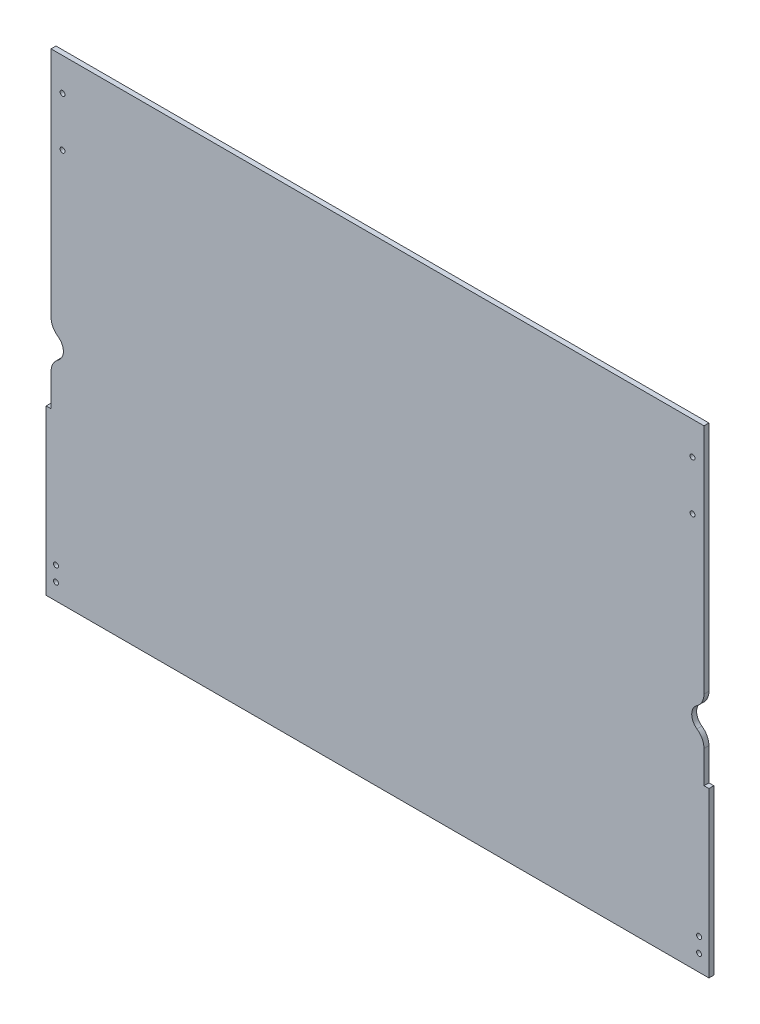
ISO-10303-21;
HEADER;
FILE_DESCRIPTION(('STEP AP214'),'2;1');
FILE_NAME('part.step','',(''),(''),'','','');
FILE_SCHEMA(('AUTOMOTIVE_DESIGN { 1 0 10303 214 1 1 1 1 }'));
ENDSEC;
DATA;
#1=APPLICATION_CONTEXT('core data for automotive mechanical design processes');
#2=APPLICATION_PROTOCOL_DEFINITION('international standard','automotive_design',2000,#1);
#3=PRODUCT_CONTEXT('',#1,'mechanical');
#4=PRODUCT('Part','Part','',(#3));
#5=PRODUCT_RELATED_PRODUCT_CATEGORY('part','',(#4));
#6=PRODUCT_DEFINITION_FORMATION('','',#4);
#7=PRODUCT_DEFINITION_CONTEXT('part definition',#1,'design');
#8=PRODUCT_DEFINITION('design','',#6,#7);
#9=PRODUCT_DEFINITION_SHAPE('','',#8);
#10=(LENGTH_UNIT() NAMED_UNIT(*) SI_UNIT(.MILLI.,.METRE.));
#11=(NAMED_UNIT(*) PLANE_ANGLE_UNIT() SI_UNIT($,.RADIAN.));
#12=(NAMED_UNIT(*) SI_UNIT($,.STERADIAN.) SOLID_ANGLE_UNIT());
#13=UNCERTAINTY_MEASURE_WITH_UNIT(LENGTH_MEASURE(1.E-05),#10,'distance_accuracy_value','');
#14=(GEOMETRIC_REPRESENTATION_CONTEXT(3) GLOBAL_UNCERTAINTY_ASSIGNED_CONTEXT((#13)) GLOBAL_UNIT_ASSIGNED_CONTEXT((#10,
#11,#12)) REPRESENTATION_CONTEXT('',''));
#15=CARTESIAN_POINT('',(0.,0.,0.));
#16=DIRECTION('',(0.,0.,1.));
#17=DIRECTION('',(1.,0.,0.));
#18=AXIS2_PLACEMENT_3D('',#15,#16,#17);
#19=CARTESIAN_POINT('',(199.,290.,3.));
#20=DIRECTION('',(-1.,0.,0.));
#21=DIRECTION('',(0.,-1.,0.));
#22=AXIS2_PLACEMENT_3D('',#19,#20,#21);
#23=PLANE('',#22);
#24=DIRECTION('',(0.,1.,0.));
#25=VECTOR('',#24,1.);
#26=CARTESIAN_POINT('',(199.,290.,0.));
#27=LINE('',#26,#25);
#28=CARTESIAN_POINT('',(199.,100.,0.));
#29=VERTEX_POINT('',#28);
#30=CARTESIAN_POINT('',(199.,119.638593383655,0.));
#31=VERTEX_POINT('',#30);
#32=EDGE_CURVE('E257',#29,#31,#27,.T.);
#33=ORIENTED_EDGE('',*,*,#32,.T.);
#34=DIRECTION('',(0.,0.,1.));
#35=VECTOR('',#34,1.);
#36=CARTESIAN_POINT('',(199.,119.638593383655,3.));
#37=LINE('',#36,#35);
#38=CARTESIAN_POINT('',(199.,119.638593383655,3.));
#39=VERTEX_POINT('',#38);
#40=EDGE_CURVE('E227',#31,#39,#37,.T.);
#41=ORIENTED_EDGE('',*,*,#40,.T.);
#42=DIRECTION('',(0.,1.,0.));
#43=VECTOR('',#42,1.);
#44=CARTESIAN_POINT('',(199.,290.,3.));
#45=LINE('',#44,#43);
#46=CARTESIAN_POINT('',(199.,100.,3.));
#47=VERTEX_POINT('',#46);
#48=EDGE_CURVE('E256',#47,#39,#45,.T.);
#49=ORIENTED_EDGE('',*,*,#48,.F.);
#50=DIRECTION('',(0.,0.,-1.));
#51=VECTOR('',#50,1.);
#52=CARTESIAN_POINT('',(199.,100.,3.));
#53=LINE('',#52,#51);
#54=EDGE_CURVE('E310',#47,#29,#53,.T.);
#55=ORIENTED_EDGE('',*,*,#54,.T.);
#56=EDGE_LOOP('',(#33,#41,#49,#55));
#57=FACE_BOUND('',#56,.T.);
#58=ADVANCED_FACE('F39',(#57),#23,.F.);
#59=CARTESIAN_POINT('',(-199.,290.,3.));
#60=DIRECTION('',(1.,0.,0.));
#61=DIRECTION('',(0.,1.,0.));
#62=AXIS2_PLACEMENT_3D('',#59,#60,#61);
#63=PLANE('',#62);
#64=DIRECTION('',(0.,-1.,0.));
#65=VECTOR('',#64,1.);
#66=CARTESIAN_POINT('',(-199.,290.,0.));
#67=LINE('',#66,#65);
#68=CARTESIAN_POINT('',(-199.,290.,0.));
#69=VERTEX_POINT('',#68);
#70=CARTESIAN_POINT('',(-199.,148.361406616345,0.));
#71=VERTEX_POINT('',#70);
#72=EDGE_CURVE('E180',#69,#71,#67,.T.);
#73=ORIENTED_EDGE('',*,*,#72,.T.);
#74=DIRECTION('',(0.,0.,1.));
#75=VECTOR('',#74,1.);
#76=CARTESIAN_POINT('',(-199.,148.361406616345,3.));
#77=LINE('',#76,#75);
#78=CARTESIAN_POINT('',(-199.,148.361406616345,3.));
#79=VERTEX_POINT('',#78);
#80=EDGE_CURVE('E186',#71,#79,#77,.T.);
#81=ORIENTED_EDGE('',*,*,#80,.T.);
#82=DIRECTION('',(0.,-1.,0.));
#83=VECTOR('',#82,1.);
#84=CARTESIAN_POINT('',(-199.,290.,3.));
#85=LINE('',#84,#83);
#86=CARTESIAN_POINT('',(-199.,290.,3.));
#87=VERTEX_POINT('',#86);
#88=EDGE_CURVE('E271',#87,#79,#85,.T.);
#89=ORIENTED_EDGE('',*,*,#88,.F.);
#90=DIRECTION('',(0.,0.,-1.));
#91=VECTOR('',#90,1.);
#92=CARTESIAN_POINT('',(-199.,290.,3.));
#93=LINE('',#92,#91);
#94=EDGE_CURVE('E302',#87,#69,#93,.T.);
#95=ORIENTED_EDGE('',*,*,#94,.T.);
#96=EDGE_LOOP('',(#73,#81,#89,#95));
#97=FACE_BOUND('',#96,.T.);
#98=ADVANCED_FACE('F420',(#97),#63,.F.);
#99=CARTESIAN_POINT('',(-199.,100.,3.));
#100=DIRECTION('',(0.,-1.,0.));
#101=DIRECTION('',(0.,0.,-1.));
#102=AXIS2_PLACEMENT_3D('',#99,#100,#101);
#103=PLANE('',#102);
#104=DIRECTION('',(-1.,0.,0.));
#105=VECTOR('',#104,1.);
#106=CARTESIAN_POINT('',(-199.,100.,0.));
#107=LINE('',#106,#105);
#108=CARTESIAN_POINT('',(-199.,100.,0.));
#109=VERTEX_POINT('',#108);
#110=CARTESIAN_POINT('',(-202.,100.,0.));
#111=VERTEX_POINT('',#110);
#112=EDGE_CURVE('E184',#109,#111,#107,.T.);
#113=ORIENTED_EDGE('',*,*,#112,.T.);
#114=DIRECTION('',(0.,0.,-1.));
#115=VECTOR('',#114,1.);
#116=CARTESIAN_POINT('',(-202.,100.,3.));
#117=LINE('',#116,#115);
#118=CARTESIAN_POINT('',(-202.,100.,3.));
#119=VERTEX_POINT('',#118);
#120=EDGE_CURVE('E160',#119,#111,#117,.T.);
#121=ORIENTED_EDGE('',*,*,#120,.F.);
#122=DIRECTION('',(-1.,0.,0.));
#123=VECTOR('',#122,1.);
#124=CARTESIAN_POINT('',(-199.,100.,3.));
#125=LINE('',#124,#123);
#126=CARTESIAN_POINT('',(-199.,100.,3.));
#127=VERTEX_POINT('',#126);
#128=EDGE_CURVE('E168',#127,#119,#125,.T.);
#129=ORIENTED_EDGE('',*,*,#128,.F.);
#130=DIRECTION('',(0.,0.,-1.));
#131=VECTOR('',#130,1.);
#132=CARTESIAN_POINT('',(-199.,100.,3.));
#133=LINE('',#132,#131);
#134=EDGE_CURVE('E274',#127,#109,#133,.T.);
#135=ORIENTED_EDGE('',*,*,#134,.T.);
#136=EDGE_LOOP('',(#113,#121,#129,#135));
#137=FACE_BOUND('',#136,.T.);
#138=ADVANCED_FACE('F182',(#137),#103,.F.);
#139=CARTESIAN_POINT('',(-202.,100.,3.));
#140=DIRECTION('',(1.,0.,0.));
#141=DIRECTION('',(0.,0.,-1.));
#142=AXIS2_PLACEMENT_3D('',#139,#140,#141);
#143=PLANE('',#142);
#144=DIRECTION('',(0.,-1.,0.));
#145=VECTOR('',#144,1.);
#146=CARTESIAN_POINT('',(-202.,100.,0.));
#147=LINE('',#146,#145);
#148=CARTESIAN_POINT('',(-202.,0.,0.));
#149=VERTEX_POINT('',#148);
#150=EDGE_CURVE('E277',#111,#149,#147,.T.);
#151=ORIENTED_EDGE('',*,*,#150,.T.);
#152=DIRECTION('',(0.,0.,-1.));
#153=VECTOR('',#152,1.);
#154=CARTESIAN_POINT('',(-202.,0.,3.));
#155=LINE('',#154,#153);
#156=CARTESIAN_POINT('',(-202.,0.,3.));
#157=VERTEX_POINT('',#156);
#158=EDGE_CURVE('E163',#157,#149,#155,.T.);
#159=ORIENTED_EDGE('',*,*,#158,.F.);
#160=DIRECTION('',(0.,-1.,0.));
#161=VECTOR('',#160,1.);
#162=CARTESIAN_POINT('',(-202.,100.,3.));
#163=LINE('',#162,#161);
#164=EDGE_CURVE('E156',#119,#157,#163,.T.);
#165=ORIENTED_EDGE('',*,*,#164,.F.);
#166=ORIENTED_EDGE('',*,*,#120,.T.);
#167=EDGE_LOOP('',(#151,#159,#165,#166));
#168=FACE_BOUND('',#167,.T.);
#169=ADVANCED_FACE('F158',(#168),#143,.F.);
#170=CARTESIAN_POINT('',(-202.,0.,3.));
#171=DIRECTION('',(0.,1.,0.));
#172=DIRECTION('',(0.,0.,1.));
#173=AXIS2_PLACEMENT_3D('',#170,#171,#172);
#174=PLANE('',#173);
#175=DIRECTION('',(1.,0.,0.));
#176=VECTOR('',#175,1.);
#177=CARTESIAN_POINT('',(-202.,0.,0.));
#178=LINE('',#177,#176);
#179=CARTESIAN_POINT('',(202.,0.,0.));
#180=VERTEX_POINT('',#179);
#181=EDGE_CURVE('E281',#149,#180,#178,.T.);
#182=ORIENTED_EDGE('',*,*,#181,.T.);
#183=DIRECTION('',(0.,0.,-1.));
#184=VECTOR('',#183,1.);
#185=CARTESIAN_POINT('',(202.,0.,3.));
#186=LINE('',#185,#184);
#187=CARTESIAN_POINT('',(202.,0.,3.));
#188=VERTEX_POINT('',#187);
#189=EDGE_CURVE('E193',#188,#180,#186,.T.);
#190=ORIENTED_EDGE('',*,*,#189,.F.);
#191=DIRECTION('',(1.,0.,0.));
#192=VECTOR('',#191,1.);
#193=CARTESIAN_POINT('',(-202.,0.,3.));
#194=LINE('',#193,#192);
#195=EDGE_CURVE('E167',#157,#188,#194,.T.);
#196=ORIENTED_EDGE('',*,*,#195,.F.);
#197=ORIENTED_EDGE('',*,*,#158,.T.);
#198=EDGE_LOOP('',(#182,#190,#196,#197));
#199=FACE_BOUND('',#198,.T.);
#200=ADVANCED_FACE('F410',(#199),#174,.F.);
#201=CARTESIAN_POINT('',(202.,100.,3.));
#202=DIRECTION('',(-1.,0.,0.));
#203=DIRECTION('',(0.,0.,1.));
#204=AXIS2_PLACEMENT_3D('',#201,#202,#203);
#205=PLANE('',#204);
#206=DIRECTION('',(0.,1.,0.));
#207=VECTOR('',#206,1.);
#208=CARTESIAN_POINT('',(202.,100.,0.));
#209=LINE('',#208,#207);
#210=CARTESIAN_POINT('',(202.,100.,0.));
#211=VERTEX_POINT('',#210);
#212=EDGE_CURVE('E284',#180,#211,#209,.T.);
#213=ORIENTED_EDGE('',*,*,#212,.T.);
#214=DIRECTION('',(0.,0.,-1.));
#215=VECTOR('',#214,1.);
#216=CARTESIAN_POINT('',(202.,100.,3.));
#217=LINE('',#216,#215);
#218=CARTESIAN_POINT('',(202.,100.,3.));
#219=VERTEX_POINT('',#218);
#220=EDGE_CURVE('E313',#219,#211,#217,.T.);
#221=ORIENTED_EDGE('',*,*,#220,.F.);
#222=DIRECTION('',(0.,1.,0.));
#223=VECTOR('',#222,1.);
#224=CARTESIAN_POINT('',(202.,100.,3.));
#225=LINE('',#224,#223);
#226=EDGE_CURVE('E324',#188,#219,#225,.T.);
#227=ORIENTED_EDGE('',*,*,#226,.F.);
#228=ORIENTED_EDGE('',*,*,#189,.T.);
#229=EDGE_LOOP('',(#213,#221,#227,#228));
#230=FACE_BOUND('',#229,.T.);
#231=ADVANCED_FACE('F322',(#230),#205,.F.);
#232=CARTESIAN_POINT('',(199.,100.,3.));
#233=DIRECTION('',(0.,-1.,0.));
#234=DIRECTION('',(0.,0.,-1.));
#235=AXIS2_PLACEMENT_3D('',#232,#233,#234);
#236=PLANE('',#235);
#237=DIRECTION('',(-1.,0.,0.));
#238=VECTOR('',#237,1.);
#239=CARTESIAN_POINT('',(199.,100.,0.));
#240=LINE('',#239,#238);
#241=EDGE_CURVE('E287',#211,#29,#240,.T.);
#242=ORIENTED_EDGE('',*,*,#241,.T.);
#243=ORIENTED_EDGE('',*,*,#54,.F.);
#244=DIRECTION('',(-1.,0.,0.));
#245=VECTOR('',#244,1.);
#246=CARTESIAN_POINT('',(199.,100.,3.));
#247=LINE('',#246,#245);
#248=EDGE_CURVE('E259',#219,#47,#247,.T.);
#249=ORIENTED_EDGE('',*,*,#248,.F.);
#250=ORIENTED_EDGE('',*,*,#220,.T.);
#251=EDGE_LOOP('',(#242,#243,#249,#250));
#252=FACE_BOUND('',#251,.T.);
#253=ADVANCED_FACE('F329',(#252),#236,.F.);
#254=CARTESIAN_POINT('',(199.,148.361406616345,3.));
#255=VERTEX_POINT('',#254);
#256=CARTESIAN_POINT('',(199.,290.,3.));
#257=VERTEX_POINT('',#256);
#258=EDGE_CURVE('E263',#255,#257,#45,.T.);
#259=ORIENTED_EDGE('',*,*,#258,.F.);
#260=DIRECTION('',(0.,0.,1.));
#261=VECTOR('',#260,1.);
#262=CARTESIAN_POINT('',(199.,148.361406616345,3.));
#263=LINE('',#262,#261);
#264=CARTESIAN_POINT('',(199.,148.361406616345,0.));
#265=VERTEX_POINT('',#264);
#266=EDGE_CURVE('E11',#255,#265,#263,.F.);
#267=ORIENTED_EDGE('',*,*,#266,.T.);
#268=CARTESIAN_POINT('',(199.,290.,0.));
#269=VERTEX_POINT('',#268);
#270=EDGE_CURVE('E290',#265,#269,#27,.T.);
#271=ORIENTED_EDGE('',*,*,#270,.T.);
#272=DIRECTION('',(0.,0.,-1.));
#273=VECTOR('',#272,1.);
#274=CARTESIAN_POINT('',(199.,290.,3.));
#275=LINE('',#274,#273);
#276=EDGE_CURVE('E306',#257,#269,#275,.T.);
#277=ORIENTED_EDGE('',*,*,#276,.F.);
#278=EDGE_LOOP('',(#259,#267,#271,#277));
#279=FACE_BOUND('',#278,.T.);
#280=ADVANCED_FACE('F422',(#279),#23,.F.);
#281=CARTESIAN_POINT('',(199.,290.,3.));
#282=DIRECTION('',(0.,-1.,0.));
#283=DIRECTION('',(0.,0.,-1.));
#284=AXIS2_PLACEMENT_3D('',#281,#282,#283);
#285=PLANE('',#284);
#286=DIRECTION('',(-1.,0.,0.));
#287=VECTOR('',#286,1.);
#288=CARTESIAN_POINT('',(199.,290.,0.));
#289=LINE('',#288,#287);
#290=EDGE_CURVE('E293',#269,#69,#289,.T.);
#291=ORIENTED_EDGE('',*,*,#290,.T.);
#292=ORIENTED_EDGE('',*,*,#94,.F.);
#293=DIRECTION('',(-1.,0.,0.));
#294=VECTOR('',#293,1.);
#295=CARTESIAN_POINT('',(199.,290.,3.));
#296=LINE('',#295,#294);
#297=EDGE_CURVE('E262',#257,#87,#296,.T.);
#298=ORIENTED_EDGE('',*,*,#297,.F.);
#299=ORIENTED_EDGE('',*,*,#276,.T.);
#300=EDGE_LOOP('',(#291,#292,#298,#299));
#301=FACE_BOUND('',#300,.T.);
#302=ADVANCED_FACE('F431',(#301),#285,.F.);
#303=CARTESIAN_POINT('',(-199.,119.638593383655,3.));
#304=VERTEX_POINT('',#303);
#305=EDGE_CURVE('E175',#304,#127,#85,.T.);
#306=ORIENTED_EDGE('',*,*,#305,.F.);
#307=DIRECTION('',(0.,0.,1.));
#308=VECTOR('',#307,1.);
#309=CARTESIAN_POINT('',(-199.,119.638593383655,3.));
#310=LINE('',#309,#308);
#311=CARTESIAN_POINT('',(-199.,119.638593383655,0.));
#312=VERTEX_POINT('',#311);
#313=EDGE_CURVE('E224',#304,#312,#310,.F.);
#314=ORIENTED_EDGE('',*,*,#313,.T.);
#315=EDGE_CURVE('E296',#312,#109,#67,.T.);
#316=ORIENTED_EDGE('',*,*,#315,.T.);
#317=ORIENTED_EDGE('',*,*,#134,.F.);
#318=EDGE_LOOP('',(#306,#314,#316,#317));
#319=FACE_BOUND('',#318,.T.);
#320=ADVANCED_FACE('F409',(#319),#63,.F.);
#321=CARTESIAN_POINT('',(0.,0.,3.));
#322=DIRECTION('',(0.,0.,1.));
#323=DIRECTION('',(1.,0.,0.));
#324=AXIS2_PLACEMENT_3D('',#321,#322,#323);
#325=PLANE('',#324);
#326=ORIENTED_EDGE('',*,*,#88,.T.);
#327=CARTESIAN_POINT('',(-189.,148.361406616345,3.));
#328=DIRECTION('',(0.,0.,1.));
#329=DIRECTION('',(1.,0.,0.));
#330=AXIS2_PLACEMENT_3D('',#327,#328,#329);
#331=CIRCLE('',#330,10.);
#332=CARTESIAN_POINT('',(-194.714285714286,140.154888549862,3.));
#333=VERTEX_POINT('',#332);
#334=EDGE_CURVE('E205',#79,#333,#331,.T.);
#335=ORIENTED_EDGE('',*,*,#334,.T.);
#336=CARTESIAN_POINT('',(-199.,134.,3.));
#337=DIRECTION('',(0.,0.,1.));
#338=DIRECTION('',(-1.,0.,0.));
#339=AXIS2_PLACEMENT_3D('',#336,#337,#338);
#340=CIRCLE('',#339,7.50000000000001);
#341=CARTESIAN_POINT('',(-194.714285714286,127.845111450138,3.));
#342=VERTEX_POINT('',#341);
#343=EDGE_CURVE('E397',#342,#333,#340,.T.);
#344=ORIENTED_EDGE('',*,*,#343,.F.);
#345=CARTESIAN_POINT('',(-189.,119.638593383655,3.));
#346=DIRECTION('',(0.,0.,1.));
#347=DIRECTION('',(1.,0.,0.));
#348=AXIS2_PLACEMENT_3D('',#345,#346,#347);
#349=CIRCLE('',#348,10.);
#350=EDGE_CURVE('E202',#342,#304,#349,.T.);
#351=ORIENTED_EDGE('',*,*,#350,.T.);
#352=ORIENTED_EDGE('',*,*,#305,.T.);
#353=ORIENTED_EDGE('',*,*,#128,.T.);
#354=ORIENTED_EDGE('',*,*,#164,.T.);
#355=ORIENTED_EDGE('',*,*,#195,.T.);
#356=ORIENTED_EDGE('',*,*,#226,.T.);
#357=ORIENTED_EDGE('',*,*,#248,.T.);
#358=ORIENTED_EDGE('',*,*,#48,.T.);
#359=CARTESIAN_POINT('',(189.,119.638593383655,3.));
#360=DIRECTION('',(0.,0.,1.));
#361=DIRECTION('',(1.,0.,0.));
#362=AXIS2_PLACEMENT_3D('',#359,#360,#361);
#363=CIRCLE('',#362,10.);
#364=CARTESIAN_POINT('',(194.714285714286,127.845111450138,3.));
#365=VERTEX_POINT('',#364);
#366=EDGE_CURVE('E199',#39,#365,#363,.T.);
#367=ORIENTED_EDGE('',*,*,#366,.T.);
#368=CARTESIAN_POINT('',(199.,134.,3.));
#369=DIRECTION('',(0.,0.,1.));
#370=DIRECTION('',(1.,0.,0.));
#371=AXIS2_PLACEMENT_3D('',#368,#369,#370);
#372=CIRCLE('',#371,7.50000000000001);
#373=CARTESIAN_POINT('',(194.714285714286,140.154888549862,3.));
#374=VERTEX_POINT('',#373);
#375=EDGE_CURVE('E242',#374,#365,#372,.T.);
#376=ORIENTED_EDGE('',*,*,#375,.F.);
#377=CARTESIAN_POINT('',(189.,148.361406616345,3.));
#378=DIRECTION('',(0.,0.,1.));
#379=DIRECTION('',(1.,0.,0.));
#380=AXIS2_PLACEMENT_3D('',#377,#378,#379);
#381=CIRCLE('',#380,10.);
#382=EDGE_CURVE('E191',#374,#255,#381,.T.);
#383=ORIENTED_EDGE('',*,*,#382,.T.);
#384=ORIENTED_EDGE('',*,*,#258,.T.);
#385=ORIENTED_EDGE('',*,*,#297,.T.);
#386=EDGE_LOOP('',(#326,#335,#344,#351,#352,#353,#354,#355,#356,#357,#358,#367,#376,#383,#384,#385));
#387=FACE_BOUND('',#386,.T.);
#388=CARTESIAN_POINT('',(196.,19.,3.));
#389=DIRECTION('',(0.,0.,1.));
#390=DIRECTION('',(1.,0.,0.));
#391=AXIS2_PLACEMENT_3D('',#388,#389,#390);
#392=CIRCLE('',#391,1.5);
#393=CARTESIAN_POINT('',(197.5,19.,3.));
#394=VERTEX_POINT('',#393);
#395=EDGE_CURVE('E359',#394,#394,#392,.T.);
#396=ORIENTED_EDGE('',*,*,#395,.F.);
#397=EDGE_LOOP('',(#396));
#398=FACE_BOUND('',#397,.T.);
#399=CARTESIAN_POINT('',(-192.,270.,3.));
#400=DIRECTION('',(0.,0.,1.));
#401=DIRECTION('',(-1.,0.,0.));
#402=AXIS2_PLACEMENT_3D('',#399,#400,#401);
#403=CIRCLE('',#402,1.5);
#404=CARTESIAN_POINT('',(-193.5,270.,3.));
#405=VERTEX_POINT('',#404);
#406=EDGE_CURVE('E368',#405,#405,#403,.T.);
#407=ORIENTED_EDGE('',*,*,#406,.F.);
#408=EDGE_LOOP('',(#407));
#409=FACE_BOUND('',#408,.T.);
#410=CARTESIAN_POINT('',(-192.,240.,3.));
#411=DIRECTION('',(0.,0.,1.));
#412=DIRECTION('',(-1.,0.,0.));
#413=AXIS2_PLACEMENT_3D('',#410,#411,#412);
#414=CIRCLE('',#413,1.5);
#415=CARTESIAN_POINT('',(-193.5,240.,3.));
#416=VERTEX_POINT('',#415);
#417=EDGE_CURVE('E343',#416,#416,#414,.T.);
#418=ORIENTED_EDGE('',*,*,#417,.F.);
#419=EDGE_LOOP('',(#418));
#420=FACE_BOUND('',#419,.T.);
#421=CARTESIAN_POINT('',(192.,240.,3.));
#422=DIRECTION('',(0.,0.,1.));
#423=DIRECTION('',(1.,0.,0.));
#424=AXIS2_PLACEMENT_3D('',#421,#422,#423);
#425=CIRCLE('',#424,1.5);
#426=CARTESIAN_POINT('',(193.5,240.,3.));
#427=VERTEX_POINT('',#426);
#428=EDGE_CURVE('E352',#427,#427,#425,.T.);
#429=ORIENTED_EDGE('',*,*,#428,.F.);
#430=EDGE_LOOP('',(#429));
#431=FACE_BOUND('',#430,.T.);
#432=CARTESIAN_POINT('',(196.,10.,3.));
#433=DIRECTION('',(0.,0.,1.));
#434=DIRECTION('',(1.,0.,0.));
#435=AXIS2_PLACEMENT_3D('',#432,#433,#434);
#436=CIRCLE('',#435,1.5);
#437=CARTESIAN_POINT('',(197.5,10.,3.));
#438=VERTEX_POINT('',#437);
#439=EDGE_CURVE('E390',#438,#438,#436,.T.);
#440=ORIENTED_EDGE('',*,*,#439,.F.);
#441=EDGE_LOOP('',(#440));
#442=FACE_BOUND('',#441,.T.);
#443=CARTESIAN_POINT('',(-196.,9.99999999999995,3.));
#444=DIRECTION('',(0.,0.,1.));
#445=DIRECTION('',(-1.,0.,0.));
#446=AXIS2_PLACEMENT_3D('',#443,#444,#445);
#447=CIRCLE('',#446,1.5);
#448=CARTESIAN_POINT('',(-197.5,9.99999999999995,3.));
#449=VERTEX_POINT('',#448);
#450=EDGE_CURVE('E382',#449,#449,#447,.T.);
#451=ORIENTED_EDGE('',*,*,#450,.F.);
#452=EDGE_LOOP('',(#451));
#453=FACE_BOUND('',#452,.T.);
#454=CARTESIAN_POINT('',(-196.,19.,3.));
#455=DIRECTION('',(0.,0.,1.));
#456=DIRECTION('',(-1.,0.,0.));
#457=AXIS2_PLACEMENT_3D('',#454,#455,#456);
#458=CIRCLE('',#457,1.5);
#459=CARTESIAN_POINT('',(-197.5,19.,3.));
#460=VERTEX_POINT('',#459);
#461=EDGE_CURVE('E248',#460,#460,#458,.T.);
#462=ORIENTED_EDGE('',*,*,#461,.F.);
#463=EDGE_LOOP('',(#462));
#464=FACE_BOUND('',#463,.T.);
#465=CARTESIAN_POINT('',(192.,270.,3.));
#466=DIRECTION('',(0.,0.,1.));
#467=DIRECTION('',(1.,0.,0.));
#468=AXIS2_PLACEMENT_3D('',#465,#466,#467);
#469=CIRCLE('',#468,1.5);
#470=CARTESIAN_POINT('',(193.5,270.,3.));
#471=VERTEX_POINT('',#470);
#472=EDGE_CURVE('E335',#471,#471,#469,.T.);
#473=ORIENTED_EDGE('',*,*,#472,.F.);
#474=EDGE_LOOP('',(#473));
#475=FACE_BOUND('',#474,.T.);
#476=ADVANCED_FACE('F172',(#387,#398,#409,#420,#431,#442,#453,#464,#475),#325,.T.);
#477=CARTESIAN_POINT('',(0.,0.,0.));
#478=DIRECTION('',(0.,0.,1.));
#479=DIRECTION('',(1.,0.,0.));
#480=AXIS2_PLACEMENT_3D('',#477,#478,#479);
#481=PLANE('',#480);
#482=CARTESIAN_POINT('',(196.,19.,0.));
#483=DIRECTION('',(0.,0.,1.));
#484=DIRECTION('',(1.,0.,0.));
#485=AXIS2_PLACEMENT_3D('',#482,#483,#484);
#486=CIRCLE('',#485,1.5);
#487=CARTESIAN_POINT('',(197.5,19.,0.));
#488=VERTEX_POINT('',#487);
#489=EDGE_CURVE('E363',#488,#488,#486,.T.);
#490=ORIENTED_EDGE('',*,*,#489,.T.);
#491=EDGE_LOOP('',(#490));
#492=FACE_BOUND('',#491,.T.);
#493=CARTESIAN_POINT('',(-192.,270.,0.));
#494=DIRECTION('',(0.,0.,1.));
#495=DIRECTION('',(-1.,0.,0.));
#496=AXIS2_PLACEMENT_3D('',#493,#494,#495);
#497=CIRCLE('',#496,1.5);
#498=CARTESIAN_POINT('',(-193.5,270.,0.));
#499=VERTEX_POINT('',#498);
#500=EDGE_CURVE('E348',#499,#499,#497,.T.);
#501=ORIENTED_EDGE('',*,*,#500,.T.);
#502=EDGE_LOOP('',(#501));
#503=FACE_BOUND('',#502,.T.);
#504=CARTESIAN_POINT('',(-192.,240.,0.));
#505=DIRECTION('',(0.,0.,1.));
#506=DIRECTION('',(-1.,0.,0.));
#507=AXIS2_PLACEMENT_3D('',#504,#505,#506);
#508=CIRCLE('',#507,1.5);
#509=CARTESIAN_POINT('',(-193.5,240.,0.));
#510=VERTEX_POINT('',#509);
#511=EDGE_CURVE('E347',#510,#510,#508,.T.);
#512=ORIENTED_EDGE('',*,*,#511,.T.);
#513=EDGE_LOOP('',(#512));
#514=FACE_BOUND('',#513,.T.);
#515=CARTESIAN_POINT('',(192.,240.,0.));
#516=DIRECTION('',(0.,0.,1.));
#517=DIRECTION('',(1.,0.,0.));
#518=AXIS2_PLACEMENT_3D('',#515,#516,#517);
#519=CIRCLE('',#518,1.5);
#520=CARTESIAN_POINT('',(193.5,240.,0.));
#521=VERTEX_POINT('',#520);
#522=EDGE_CURVE('E339',#521,#521,#519,.T.);
#523=ORIENTED_EDGE('',*,*,#522,.T.);
#524=EDGE_LOOP('',(#523));
#525=FACE_BOUND('',#524,.T.);
#526=CARTESIAN_POINT('',(196.,10.,0.));
#527=DIRECTION('',(0.,0.,1.));
#528=DIRECTION('',(1.,0.,0.));
#529=AXIS2_PLACEMENT_3D('',#526,#527,#528);
#530=CIRCLE('',#529,1.5);
#531=CARTESIAN_POINT('',(197.5,10.,0.));
#532=VERTEX_POINT('',#531);
#533=EDGE_CURVE('E364',#532,#532,#530,.T.);
#534=ORIENTED_EDGE('',*,*,#533,.T.);
#535=EDGE_LOOP('',(#534));
#536=FACE_BOUND('',#535,.T.);
#537=CARTESIAN_POINT('',(-196.,9.99999999999995,0.));
#538=DIRECTION('',(0.,0.,1.));
#539=DIRECTION('',(-1.,0.,0.));
#540=AXIS2_PLACEMENT_3D('',#537,#538,#539);
#541=CIRCLE('',#540,1.5);
#542=CARTESIAN_POINT('',(-197.5,9.99999999999995,0.));
#543=VERTEX_POINT('',#542);
#544=EDGE_CURVE('E386',#543,#543,#541,.T.);
#545=ORIENTED_EDGE('',*,*,#544,.T.);
#546=EDGE_LOOP('',(#545));
#547=FACE_BOUND('',#546,.T.);
#548=CARTESIAN_POINT('',(-196.,19.,0.));
#549=DIRECTION('',(0.,0.,1.));
#550=DIRECTION('',(-1.,0.,0.));
#551=AXIS2_PLACEMENT_3D('',#548,#549,#550);
#552=CIRCLE('',#551,1.5);
#553=CARTESIAN_POINT('',(-197.5,19.,0.));
#554=VERTEX_POINT('',#553);
#555=EDGE_CURVE('E378',#554,#554,#552,.T.);
#556=ORIENTED_EDGE('',*,*,#555,.T.);
#557=EDGE_LOOP('',(#556));
#558=FACE_BOUND('',#557,.T.);
#559=CARTESIAN_POINT('',(192.,270.,0.));
#560=DIRECTION('',(0.,0.,1.));
#561=DIRECTION('',(1.,0.,0.));
#562=AXIS2_PLACEMENT_3D('',#559,#560,#561);
#563=CIRCLE('',#562,1.5);
#564=CARTESIAN_POINT('',(193.5,270.,0.));
#565=VERTEX_POINT('',#564);
#566=EDGE_CURVE('E278',#565,#565,#563,.T.);
#567=ORIENTED_EDGE('',*,*,#566,.T.);
#568=EDGE_LOOP('',(#567));
#569=FACE_BOUND('',#568,.T.);
#570=CARTESIAN_POINT('',(-199.,134.,0.));
#571=DIRECTION('',(0.,0.,1.));
#572=DIRECTION('',(-1.,0.,0.));
#573=AXIS2_PLACEMENT_3D('',#570,#571,#572);
#574=CIRCLE('',#573,7.50000000000001);
#575=CARTESIAN_POINT('',(-194.714285714286,127.845111450138,0.));
#576=VERTEX_POINT('',#575);
#577=CARTESIAN_POINT('',(-194.714285714286,140.154888549862,0.));
#578=VERTEX_POINT('',#577);
#579=EDGE_CURVE('E401',#576,#578,#574,.T.);
#580=ORIENTED_EDGE('',*,*,#579,.T.);
#581=CARTESIAN_POINT('',(-189.,148.361406616345,0.));
#582=DIRECTION('',(0.,0.,1.));
#583=DIRECTION('',(1.,0.,0.));
#584=AXIS2_PLACEMENT_3D('',#581,#582,#583);
#585=CIRCLE('',#584,10.);
#586=EDGE_CURVE('E221',#578,#71,#585,.F.);
#587=ORIENTED_EDGE('',*,*,#586,.T.);
#588=ORIENTED_EDGE('',*,*,#72,.F.);
#589=ORIENTED_EDGE('',*,*,#290,.F.);
#590=ORIENTED_EDGE('',*,*,#270,.F.);
#591=CARTESIAN_POINT('',(189.,148.361406616345,0.));
#592=DIRECTION('',(0.,0.,1.));
#593=DIRECTION('',(1.,0.,0.));
#594=AXIS2_PLACEMENT_3D('',#591,#592,#593);
#595=CIRCLE('',#594,10.);
#596=CARTESIAN_POINT('',(194.714285714286,140.154888549862,0.));
#597=VERTEX_POINT('',#596);
#598=EDGE_CURVE('E214',#265,#597,#595,.F.);
#599=ORIENTED_EDGE('',*,*,#598,.T.);
#600=CARTESIAN_POINT('',(199.,134.,0.));
#601=DIRECTION('',(0.,0.,1.));
#602=DIRECTION('',(1.,0.,0.));
#603=AXIS2_PLACEMENT_3D('',#600,#601,#602);
#604=CIRCLE('',#603,7.50000000000001);
#605=CARTESIAN_POINT('',(194.714285714286,127.845111450138,0.));
#606=VERTEX_POINT('',#605);
#607=EDGE_CURVE('E239',#597,#606,#604,.T.);
#608=ORIENTED_EDGE('',*,*,#607,.T.);
#609=CARTESIAN_POINT('',(189.,119.638593383655,0.));
#610=DIRECTION('',(0.,0.,1.));
#611=DIRECTION('',(1.,0.,0.));
#612=AXIS2_PLACEMENT_3D('',#609,#610,#611);
#613=CIRCLE('',#612,10.);
#614=EDGE_CURVE('E63',#606,#31,#613,.F.);
#615=ORIENTED_EDGE('',*,*,#614,.T.);
#616=ORIENTED_EDGE('',*,*,#32,.F.);
#617=ORIENTED_EDGE('',*,*,#241,.F.);
#618=ORIENTED_EDGE('',*,*,#212,.F.);
#619=ORIENTED_EDGE('',*,*,#181,.F.);
#620=ORIENTED_EDGE('',*,*,#150,.F.);
#621=ORIENTED_EDGE('',*,*,#112,.F.);
#622=ORIENTED_EDGE('',*,*,#315,.F.);
#623=CARTESIAN_POINT('',(-189.,119.638593383655,0.));
#624=DIRECTION('',(0.,0.,1.));
#625=DIRECTION('',(1.,0.,0.));
#626=AXIS2_PLACEMENT_3D('',#623,#624,#625);
#627=CIRCLE('',#626,10.);
#628=EDGE_CURVE('E55',#312,#576,#627,.F.);
#629=ORIENTED_EDGE('',*,*,#628,.T.);
#630=EDGE_LOOP('',(#580,#587,#588,#589,#590,#599,#608,#615,#616,#617,#618,#619,#620,#621,#622,#629));
#631=FACE_BOUND('',#630,.T.);
#632=ADVANCED_FACE('F245',(#492,#503,#514,#525,#536,#547,#558,#569,#631),#481,.F.);
#633=CARTESIAN_POINT('',(192.,270.,0.));
#634=DIRECTION('',(0.,0.,1.));
#635=DIRECTION('',(1.,0.,0.));
#636=AXIS2_PLACEMENT_3D('',#633,#634,#635);
#637=CYLINDRICAL_SURFACE('',#636,1.5);
#638=ORIENTED_EDGE('',*,*,#566,.F.);
#639=EDGE_LOOP('',(#638));
#640=FACE_BOUND('',#639,.T.);
#641=ORIENTED_EDGE('',*,*,#472,.T.);
#642=EDGE_LOOP('',(#641));
#643=FACE_BOUND('',#642,.T.);
#644=ADVANCED_FACE('F497',(#640,#643),#637,.F.);
#645=CARTESIAN_POINT('',(-196.,19.,0.));
#646=DIRECTION('',(0.,0.,1.));
#647=DIRECTION('',(1.,0.,0.));
#648=AXIS2_PLACEMENT_3D('',#645,#646,#647);
#649=CYLINDRICAL_SURFACE('',#648,1.5);
#650=ORIENTED_EDGE('',*,*,#555,.F.);
#651=EDGE_LOOP('',(#650));
#652=FACE_BOUND('',#651,.T.);
#653=ORIENTED_EDGE('',*,*,#461,.T.);
#654=EDGE_LOOP('',(#653));
#655=FACE_BOUND('',#654,.T.);
#656=ADVANCED_FACE('F502',(#652,#655),#649,.F.);
#657=CARTESIAN_POINT('',(-196.,9.99999999999995,0.));
#658=DIRECTION('',(0.,0.,1.));
#659=DIRECTION('',(1.,0.,0.));
#660=AXIS2_PLACEMENT_3D('',#657,#658,#659);
#661=CYLINDRICAL_SURFACE('',#660,1.5);
#662=ORIENTED_EDGE('',*,*,#544,.F.);
#663=EDGE_LOOP('',(#662));
#664=FACE_BOUND('',#663,.T.);
#665=ORIENTED_EDGE('',*,*,#450,.T.);
#666=EDGE_LOOP('',(#665));
#667=FACE_BOUND('',#666,.T.);
#668=ADVANCED_FACE('F514',(#664,#667),#661,.F.);
#669=CARTESIAN_POINT('',(196.,10.,0.));
#670=DIRECTION('',(0.,0.,1.));
#671=DIRECTION('',(1.,0.,0.));
#672=AXIS2_PLACEMENT_3D('',#669,#670,#671);
#673=CYLINDRICAL_SURFACE('',#672,1.5);
#674=ORIENTED_EDGE('',*,*,#533,.F.);
#675=EDGE_LOOP('',(#674));
#676=FACE_BOUND('',#675,.T.);
#677=ORIENTED_EDGE('',*,*,#439,.T.);
#678=EDGE_LOOP('',(#677));
#679=FACE_BOUND('',#678,.T.);
#680=ADVANCED_FACE('F524',(#676,#679),#673,.F.);
#681=CARTESIAN_POINT('',(192.,240.,0.));
#682=DIRECTION('',(0.,0.,1.));
#683=DIRECTION('',(1.,0.,0.));
#684=AXIS2_PLACEMENT_3D('',#681,#682,#683);
#685=CYLINDRICAL_SURFACE('',#684,1.5);
#686=ORIENTED_EDGE('',*,*,#522,.F.);
#687=EDGE_LOOP('',(#686));
#688=FACE_BOUND('',#687,.T.);
#689=ORIENTED_EDGE('',*,*,#428,.T.);
#690=EDGE_LOOP('',(#689));
#691=FACE_BOUND('',#690,.T.);
#692=ADVANCED_FACE('F534',(#688,#691),#685,.F.);
#693=CARTESIAN_POINT('',(-192.,240.,0.));
#694=DIRECTION('',(0.,0.,1.));
#695=DIRECTION('',(1.,0.,0.));
#696=AXIS2_PLACEMENT_3D('',#693,#694,#695);
#697=CYLINDRICAL_SURFACE('',#696,1.5);
#698=ORIENTED_EDGE('',*,*,#511,.F.);
#699=EDGE_LOOP('',(#698));
#700=FACE_BOUND('',#699,.T.);
#701=ORIENTED_EDGE('',*,*,#417,.T.);
#702=EDGE_LOOP('',(#701));
#703=FACE_BOUND('',#702,.T.);
#704=ADVANCED_FACE('F544',(#700,#703),#697,.F.);
#705=CARTESIAN_POINT('',(-192.,270.,0.));
#706=DIRECTION('',(0.,0.,1.));
#707=DIRECTION('',(1.,0.,0.));
#708=AXIS2_PLACEMENT_3D('',#705,#706,#707);
#709=CYLINDRICAL_SURFACE('',#708,1.5);
#710=ORIENTED_EDGE('',*,*,#500,.F.);
#711=EDGE_LOOP('',(#710));
#712=FACE_BOUND('',#711,.T.);
#713=ORIENTED_EDGE('',*,*,#406,.T.);
#714=EDGE_LOOP('',(#713));
#715=FACE_BOUND('',#714,.T.);
#716=ADVANCED_FACE('F554',(#712,#715),#709,.F.);
#717=CARTESIAN_POINT('',(196.,19.,0.));
#718=DIRECTION('',(0.,0.,1.));
#719=DIRECTION('',(1.,0.,0.));
#720=AXIS2_PLACEMENT_3D('',#717,#718,#719);
#721=CYLINDRICAL_SURFACE('',#720,1.5);
#722=ORIENTED_EDGE('',*,*,#489,.F.);
#723=EDGE_LOOP('',(#722));
#724=FACE_BOUND('',#723,.T.);
#725=ORIENTED_EDGE('',*,*,#395,.T.);
#726=EDGE_LOOP('',(#725));
#727=FACE_BOUND('',#726,.T.);
#728=ADVANCED_FACE('F564',(#724,#727),#721,.F.);
#729=CARTESIAN_POINT('',(-199.,134.,0.));
#730=DIRECTION('',(0.,0.,1.));
#731=DIRECTION('',(1.,0.,0.));
#732=AXIS2_PLACEMENT_3D('',#729,#730,#731);
#733=CYLINDRICAL_SURFACE('',#732,7.50000000000001);
#734=ORIENTED_EDGE('',*,*,#343,.T.);
#735=DIRECTION('',(0.,0.,1.));
#736=VECTOR('',#735,1.);
#737=CARTESIAN_POINT('',(-194.714285714286,140.154888549862,0.));
#738=LINE('',#737,#736);
#739=EDGE_CURVE('E211',#333,#578,#738,.F.);
#740=ORIENTED_EDGE('',*,*,#739,.T.);
#741=ORIENTED_EDGE('',*,*,#579,.F.);
#742=DIRECTION('',(0.,0.,1.));
#743=VECTOR('',#742,1.);
#744=CARTESIAN_POINT('',(-194.714285714286,127.845111450138,0.));
#745=LINE('',#744,#743);
#746=EDGE_CURVE('E208',#576,#342,#745,.T.);
#747=ORIENTED_EDGE('',*,*,#746,.T.);
#748=EDGE_LOOP('',(#734,#740,#741,#747));
#749=FACE_BOUND('',#748,.T.);
#750=ADVANCED_FACE('F573',(#749),#733,.F.);
#751=CARTESIAN_POINT('',(199.,134.,0.));
#752=DIRECTION('',(0.,0.,1.));
#753=DIRECTION('',(1.,0.,0.));
#754=AXIS2_PLACEMENT_3D('',#751,#752,#753);
#755=CYLINDRICAL_SURFACE('',#754,7.50000000000001);
#756=ORIENTED_EDGE('',*,*,#375,.T.);
#757=DIRECTION('',(0.,0.,1.));
#758=VECTOR('',#757,1.);
#759=CARTESIAN_POINT('',(194.714285714286,127.845111450138,0.));
#760=LINE('',#759,#758);
#761=EDGE_CURVE('E48',#365,#606,#760,.F.);
#762=ORIENTED_EDGE('',*,*,#761,.T.);
#763=ORIENTED_EDGE('',*,*,#607,.F.);
#764=DIRECTION('',(0.,0.,1.));
#765=VECTOR('',#764,1.);
#766=CARTESIAN_POINT('',(194.714285714286,140.154888549862,0.));
#767=LINE('',#766,#765);
#768=EDGE_CURVE('E231',#597,#374,#767,.T.);
#769=ORIENTED_EDGE('',*,*,#768,.T.);
#770=EDGE_LOOP('',(#756,#762,#763,#769));
#771=FACE_BOUND('',#770,.T.);
#772=ADVANCED_FACE('F238',(#771),#755,.F.);
#773=CARTESIAN_POINT('',(-189.,148.361406616345,0.));
#774=DIRECTION('',(0.,0.,1.));
#775=DIRECTION('',(1.,0.,0.));
#776=AXIS2_PLACEMENT_3D('',#773,#774,#775);
#777=CYLINDRICAL_SURFACE('',#776,10.);
#778=ORIENTED_EDGE('',*,*,#586,.F.);
#779=ORIENTED_EDGE('',*,*,#739,.F.);
#780=ORIENTED_EDGE('',*,*,#334,.F.);
#781=ORIENTED_EDGE('',*,*,#80,.F.);
#782=EDGE_LOOP('',(#778,#779,#780,#781));
#783=FACE_BOUND('',#782,.T.);
#784=ADVANCED_FACE('F452',(#783),#777,.T.);
#785=CARTESIAN_POINT('',(-189.,119.638593383655,0.));
#786=DIRECTION('',(0.,0.,1.));
#787=DIRECTION('',(1.,0.,0.));
#788=AXIS2_PLACEMENT_3D('',#785,#786,#787);
#789=CYLINDRICAL_SURFACE('',#788,10.);
#790=ORIENTED_EDGE('',*,*,#350,.F.);
#791=ORIENTED_EDGE('',*,*,#746,.F.);
#792=ORIENTED_EDGE('',*,*,#628,.F.);
#793=ORIENTED_EDGE('',*,*,#313,.F.);
#794=EDGE_LOOP('',(#790,#791,#792,#793));
#795=FACE_BOUND('',#794,.T.);
#796=ADVANCED_FACE('F448',(#795),#789,.T.);
#797=CARTESIAN_POINT('',(189.,119.638593383655,0.));
#798=DIRECTION('',(0.,0.,1.));
#799=DIRECTION('',(1.,0.,0.));
#800=AXIS2_PLACEMENT_3D('',#797,#798,#799);
#801=CYLINDRICAL_SURFACE('',#800,10.);
#802=ORIENTED_EDGE('',*,*,#614,.F.);
#803=ORIENTED_EDGE('',*,*,#761,.F.);
#804=ORIENTED_EDGE('',*,*,#366,.F.);
#805=ORIENTED_EDGE('',*,*,#40,.F.);
#806=EDGE_LOOP('',(#802,#803,#804,#805));
#807=FACE_BOUND('',#806,.T.);
#808=ADVANCED_FACE('F251',(#807),#801,.T.);
#809=CARTESIAN_POINT('',(189.,148.361406616345,0.));
#810=DIRECTION('',(0.,0.,1.));
#811=DIRECTION('',(1.,0.,0.));
#812=AXIS2_PLACEMENT_3D('',#809,#810,#811);
#813=CYLINDRICAL_SURFACE('',#812,10.);
#814=ORIENTED_EDGE('',*,*,#382,.F.);
#815=ORIENTED_EDGE('',*,*,#768,.F.);
#816=ORIENTED_EDGE('',*,*,#598,.F.);
#817=ORIENTED_EDGE('',*,*,#266,.F.);
#818=EDGE_LOOP('',(#814,#815,#816,#817));
#819=FACE_BOUND('',#818,.T.);
#820=ADVANCED_FACE('F41',(#819),#813,.T.);
#821=CLOSED_SHELL('',(#58,#98,#138,#169,#200,#231,#253,#280,#302,#320,#476,#632,#644,#656,#668,
#680,#692,#704,#716,#728,#750,#772,#784,#796,#808,#820));
#822=MANIFOLD_SOLID_BREP('B2',#821);
#823=ADVANCED_BREP_SHAPE_REPRESENTATION('',(#18,#822),#14);
#824=SHAPE_DEFINITION_REPRESENTATION(#9,#823);
ENDSEC;
END-ISO-10303-21;
